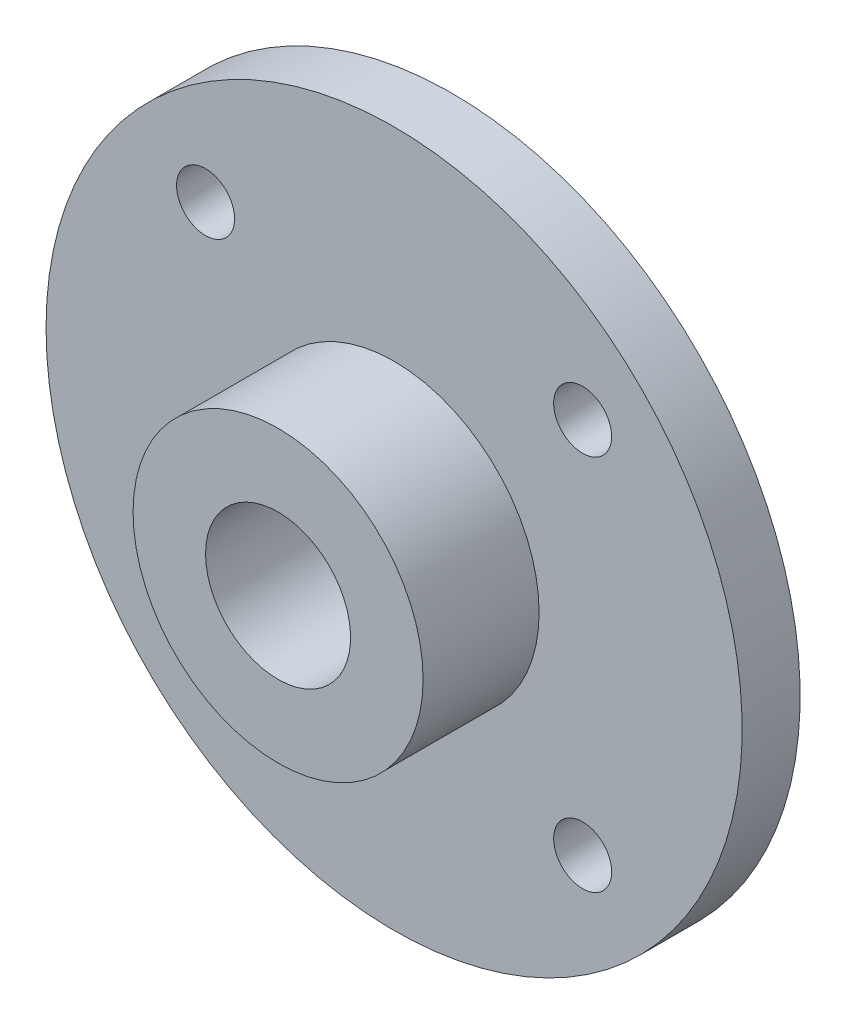
ISO-10303-21;
HEADER;
FILE_DESCRIPTION(('STEP AP214'),'2;1');
FILE_NAME('part.step','',(''),(''),'','','');
FILE_SCHEMA(('AUTOMOTIVE_DESIGN { 1 0 10303 214 1 1 1 1 }'));
ENDSEC;
DATA;
#1=APPLICATION_CONTEXT('core data for automotive mechanical design processes');
#2=APPLICATION_PROTOCOL_DEFINITION('international standard','automotive_design',2000,#1);
#3=PRODUCT_CONTEXT('',#1,'mechanical');
#4=PRODUCT('Part','Part','',(#3));
#5=PRODUCT_RELATED_PRODUCT_CATEGORY('part','',(#4));
#6=PRODUCT_DEFINITION_FORMATION('','',#4);
#7=PRODUCT_DEFINITION_CONTEXT('part definition',#1,'design');
#8=PRODUCT_DEFINITION('design','',#6,#7);
#9=PRODUCT_DEFINITION_SHAPE('','',#8);
#10=(LENGTH_UNIT() NAMED_UNIT(*) SI_UNIT(.MILLI.,.METRE.));
#11=(NAMED_UNIT(*) PLANE_ANGLE_UNIT() SI_UNIT($,.RADIAN.));
#12=(NAMED_UNIT(*) SI_UNIT($,.STERADIAN.) SOLID_ANGLE_UNIT());
#13=UNCERTAINTY_MEASURE_WITH_UNIT(LENGTH_MEASURE(1.E-05),#10,'distance_accuracy_value','');
#14=(GEOMETRIC_REPRESENTATION_CONTEXT(3) GLOBAL_UNCERTAINTY_ASSIGNED_CONTEXT((#13)) GLOBAL_UNIT_ASSIGNED_CONTEXT((#10,
#11,#12)) REPRESENTATION_CONTEXT('',''));
#15=CARTESIAN_POINT('',(0.,0.,0.));
#16=DIRECTION('',(0.,0.,1.));
#17=DIRECTION('',(1.,0.,0.));
#18=AXIS2_PLACEMENT_3D('',#15,#16,#17);
#19=CARTESIAN_POINT('',(0.,0.,6.35));
#20=DIRECTION('',(0.,0.,1.));
#21=DIRECTION('',(1.,0.,0.));
#22=AXIS2_PLACEMENT_3D('',#19,#20,#21);
#23=PLANE('',#22);
#24=CARTESIAN_POINT('',(0.,0.,6.35));
#25=DIRECTION('',(0.,0.,-1.));
#26=DIRECTION('',(-1.,0.,0.));
#27=AXIS2_PLACEMENT_3D('',#24,#25,#26);
#28=CIRCLE('',#27,7.9375);
#29=CARTESIAN_POINT('',(-7.9375,0.,6.35));
#30=VERTEX_POINT('',#29);
#31=EDGE_CURVE('E17',#30,#30,#28,.F.);
#32=ORIENTED_EDGE('',*,*,#31,.T.);
#33=EDGE_LOOP('',(#32));
#34=FACE_BOUND('',#33,.T.);
#35=ADVANCED_FACE('F14',(#34),#23,.T.);
#36=CARTESIAN_POINT('',(0.,0.,19.05));
#37=DIRECTION('',(0.,0.,-1.));
#38=DIRECTION('',(-1.,0.,0.));
#39=AXIS2_PLACEMENT_3D('',#36,#37,#38);
#40=CYLINDRICAL_SURFACE('',#39,7.9375);
#41=CARTESIAN_POINT('',(0.,0.,19.05));
#42=DIRECTION('',(0.,0.,-1.));
#43=DIRECTION('',(-1.,0.,0.));
#44=AXIS2_PLACEMENT_3D('',#41,#42,#43);
#45=CIRCLE('',#44,7.9375);
#46=CARTESIAN_POINT('',(-7.9375,0.,19.05));
#47=VERTEX_POINT('',#46);
#48=EDGE_CURVE('E57',#47,#47,#45,.T.);
#49=ORIENTED_EDGE('',*,*,#48,.F.);
#50=EDGE_LOOP('',(#49));
#51=FACE_BOUND('',#50,.T.);
#52=ORIENTED_EDGE('',*,*,#31,.F.);
#53=EDGE_LOOP('',(#52));
#54=FACE_BOUND('',#53,.T.);
#55=ADVANCED_FACE('F65',(#51,#54),#40,.F.);
#56=CARTESIAN_POINT('',(0.,0.,19.05));
#57=DIRECTION('',(0.,0.,1.));
#58=DIRECTION('',(1.,0.,0.));
#59=AXIS2_PLACEMENT_3D('',#56,#57,#58);
#60=PLANE('',#59);
#61=ORIENTED_EDGE('',*,*,#48,.T.);
#62=EDGE_LOOP('',(#61));
#63=FACE_BOUND('',#62,.T.);
#64=CARTESIAN_POINT('',(0.,0.,19.05));
#65=DIRECTION('',(0.,0.,-1.));
#66=DIRECTION('',(-1.,0.,0.));
#67=AXIS2_PLACEMENT_3D('',#64,#65,#66);
#68=CIRCLE('',#67,15.875);
#69=CARTESIAN_POINT('',(-15.875,0.,19.05));
#70=VERTEX_POINT('',#69);
#71=EDGE_CURVE('E55',#70,#70,#68,.T.);
#72=ORIENTED_EDGE('',*,*,#71,.F.);
#73=EDGE_LOOP('',(#72));
#74=FACE_BOUND('',#73,.T.);
#75=ADVANCED_FACE('F67',(#63,#74),#60,.T.);
#76=CARTESIAN_POINT('',(0.,0.,19.05));
#77=DIRECTION('',(0.,0.,-1.));
#78=DIRECTION('',(-1.,0.,0.));
#79=AXIS2_PLACEMENT_3D('',#76,#77,#78);
#80=CYLINDRICAL_SURFACE('',#79,15.875);
#81=CARTESIAN_POINT('',(0.,0.,6.35));
#82=DIRECTION('',(0.,0.,-1.));
#83=DIRECTION('',(-1.,0.,0.));
#84=AXIS2_PLACEMENT_3D('',#81,#82,#83);
#85=CIRCLE('',#84,15.875);
#86=CARTESIAN_POINT('',(-15.875,0.,6.35));
#87=VERTEX_POINT('',#86);
#88=EDGE_CURVE('E52',#87,#87,#85,.T.);
#89=ORIENTED_EDGE('',*,*,#88,.F.);
#90=EDGE_LOOP('',(#89));
#91=FACE_BOUND('',#90,.T.);
#92=ORIENTED_EDGE('',*,*,#71,.T.);
#93=EDGE_LOOP('',(#92));
#94=FACE_BOUND('',#93,.T.);
#95=ADVANCED_FACE('F74',(#91,#94),#80,.T.);
#96=CARTESIAN_POINT('',(0.,0.,6.35));
#97=DIRECTION('',(0.,0.,1.));
#98=DIRECTION('',(1.,0.,0.));
#99=AXIS2_PLACEMENT_3D('',#96,#97,#98);
#100=PLANE('',#99);
#101=CARTESIAN_POINT('',(-20.6375,-20.6375,6.35));
#102=DIRECTION('',(0.,0.,-1.));
#103=DIRECTION('',(-1.,0.,0.));
#104=AXIS2_PLACEMENT_3D('',#101,#102,#103);
#105=CIRCLE('',#104,3.175);
#106=CARTESIAN_POINT('',(-23.8125,-20.6375,6.35));
#107=VERTEX_POINT('',#106);
#108=EDGE_CURVE('E37',#107,#107,#105,.T.);
#109=ORIENTED_EDGE('',*,*,#108,.T.);
#110=EDGE_LOOP('',(#109));
#111=FACE_BOUND('',#110,.T.);
#112=CARTESIAN_POINT('',(20.6375,20.6375,6.35));
#113=DIRECTION('',(0.,0.,-1.));
#114=DIRECTION('',(-1.,0.,0.));
#115=AXIS2_PLACEMENT_3D('',#112,#113,#114);
#116=CIRCLE('',#115,3.175);
#117=CARTESIAN_POINT('',(17.4625,20.6375,6.35));
#118=VERTEX_POINT('',#117);
#119=EDGE_CURVE('E43',#118,#118,#116,.T.);
#120=ORIENTED_EDGE('',*,*,#119,.T.);
#121=EDGE_LOOP('',(#120));
#122=FACE_BOUND('',#121,.T.);
#123=CARTESIAN_POINT('',(0.,0.,6.35));
#124=DIRECTION('',(0.,0.,-1.));
#125=DIRECTION('',(-1.,0.,0.));
#126=AXIS2_PLACEMENT_3D('',#123,#124,#125);
#127=CIRCLE('',#126,38.1);
#128=CARTESIAN_POINT('',(-38.1,0.,6.35));
#129=VERTEX_POINT('',#128);
#130=EDGE_CURVE('E49',#129,#129,#127,.T.);
#131=ORIENTED_EDGE('',*,*,#130,.F.);
#132=EDGE_LOOP('',(#131));
#133=FACE_BOUND('',#132,.T.);
#134=CARTESIAN_POINT('',(-20.6375,20.6375,6.35));
#135=DIRECTION('',(0.,0.,-1.));
#136=DIRECTION('',(-1.,0.,0.));
#137=AXIS2_PLACEMENT_3D('',#134,#135,#136);
#138=CIRCLE('',#137,3.175);
#139=CARTESIAN_POINT('',(-23.8125,20.6375,6.35));
#140=VERTEX_POINT('',#139);
#141=EDGE_CURVE('E46',#140,#140,#138,.T.);
#142=ORIENTED_EDGE('',*,*,#141,.T.);
#143=EDGE_LOOP('',(#142));
#144=FACE_BOUND('',#143,.T.);
#145=CARTESIAN_POINT('',(20.6375,-20.6375,6.35));
#146=DIRECTION('',(0.,0.,-1.));
#147=DIRECTION('',(-1.,0.,0.));
#148=AXIS2_PLACEMENT_3D('',#145,#146,#147);
#149=CIRCLE('',#148,3.175);
#150=CARTESIAN_POINT('',(17.4625,-20.6375,6.35));
#151=VERTEX_POINT('',#150);
#152=EDGE_CURVE('E40',#151,#151,#149,.T.);
#153=ORIENTED_EDGE('',*,*,#152,.T.);
#154=EDGE_LOOP('',(#153));
#155=FACE_BOUND('',#154,.T.);
#156=ORIENTED_EDGE('',*,*,#88,.T.);
#157=EDGE_LOOP('',(#156));
#158=FACE_BOUND('',#157,.T.);
#159=ADVANCED_FACE('F102',(#111,#122,#133,#144,#155,#158),#100,.T.);
#160=CARTESIAN_POINT('',(0.,0.,6.35));
#161=DIRECTION('',(0.,0.,-1.));
#162=DIRECTION('',(-1.,0.,0.));
#163=AXIS2_PLACEMENT_3D('',#160,#161,#162);
#164=CYLINDRICAL_SURFACE('',#163,38.1);
#165=ORIENTED_EDGE('',*,*,#130,.T.);
#166=EDGE_LOOP('',(#165));
#167=FACE_BOUND('',#166,.T.);
#168=CARTESIAN_POINT('',(0.,0.,0.));
#169=DIRECTION('',(0.,0.,-1.));
#170=DIRECTION('',(-1.,0.,0.));
#171=AXIS2_PLACEMENT_3D('',#168,#169,#170);
#172=CIRCLE('',#171,38.1);
#173=CARTESIAN_POINT('',(-38.1,0.,0.));
#174=VERTEX_POINT('',#173);
#175=EDGE_CURVE('E34',#174,#174,#172,.F.);
#176=ORIENTED_EDGE('',*,*,#175,.T.);
#177=EDGE_LOOP('',(#176));
#178=FACE_BOUND('',#177,.T.);
#179=ADVANCED_FACE('F98',(#167,#178),#164,.T.);
#180=CARTESIAN_POINT('',(-20.6375,20.6375,6.35));
#181=DIRECTION('',(0.,0.,-1.));
#182=DIRECTION('',(-1.,0.,0.));
#183=AXIS2_PLACEMENT_3D('',#180,#181,#182);
#184=CYLINDRICAL_SURFACE('',#183,3.175);
#185=CARTESIAN_POINT('',(-20.6375,20.6375,0.));
#186=DIRECTION('',(0.,0.,-1.));
#187=DIRECTION('',(-1.,0.,0.));
#188=AXIS2_PLACEMENT_3D('',#185,#186,#187);
#189=CIRCLE('',#188,3.175);
#190=CARTESIAN_POINT('',(-23.8125,20.6375,0.));
#191=VERTEX_POINT('',#190);
#192=EDGE_CURVE('E31',#191,#191,#189,.T.);
#193=ORIENTED_EDGE('',*,*,#192,.T.);
#194=EDGE_LOOP('',(#193));
#195=FACE_BOUND('',#194,.T.);
#196=ORIENTED_EDGE('',*,*,#141,.F.);
#197=EDGE_LOOP('',(#196));
#198=FACE_BOUND('',#197,.T.);
#199=ADVANCED_FACE('F94',(#195,#198),#184,.F.);
#200=CARTESIAN_POINT('',(20.6375,20.6375,6.35));
#201=DIRECTION('',(0.,0.,-1.));
#202=DIRECTION('',(-1.,0.,0.));
#203=AXIS2_PLACEMENT_3D('',#200,#201,#202);
#204=CYLINDRICAL_SURFACE('',#203,3.175);
#205=CARTESIAN_POINT('',(20.6375,20.6375,0.));
#206=DIRECTION('',(0.,0.,-1.));
#207=DIRECTION('',(-1.,0.,0.));
#208=AXIS2_PLACEMENT_3D('',#205,#206,#207);
#209=CIRCLE('',#208,3.175);
#210=CARTESIAN_POINT('',(17.4625,20.6375,0.));
#211=VERTEX_POINT('',#210);
#212=EDGE_CURVE('E26',#211,#211,#209,.T.);
#213=ORIENTED_EDGE('',*,*,#212,.T.);
#214=EDGE_LOOP('',(#213));
#215=FACE_BOUND('',#214,.T.);
#216=ORIENTED_EDGE('',*,*,#119,.F.);
#217=EDGE_LOOP('',(#216));
#218=FACE_BOUND('',#217,.T.);
#219=ADVANCED_FACE('F90',(#215,#218),#204,.F.);
#220=CARTESIAN_POINT('',(20.6375,-20.6375,6.35));
#221=DIRECTION('',(0.,0.,-1.));
#222=DIRECTION('',(-1.,0.,0.));
#223=AXIS2_PLACEMENT_3D('',#220,#221,#222);
#224=CYLINDRICAL_SURFACE('',#223,3.175);
#225=CARTESIAN_POINT('',(20.6375,-20.6375,0.));
#226=DIRECTION('',(0.,0.,-1.));
#227=DIRECTION('',(-1.,0.,0.));
#228=AXIS2_PLACEMENT_3D('',#225,#226,#227);
#229=CIRCLE('',#228,3.175);
#230=CARTESIAN_POINT('',(17.4625,-20.6375,0.));
#231=VERTEX_POINT('',#230);
#232=EDGE_CURVE('E21',#231,#231,#229,.T.);
#233=ORIENTED_EDGE('',*,*,#232,.T.);
#234=EDGE_LOOP('',(#233));
#235=FACE_BOUND('',#234,.T.);
#236=ORIENTED_EDGE('',*,*,#152,.F.);
#237=EDGE_LOOP('',(#236));
#238=FACE_BOUND('',#237,.T.);
#239=ADVANCED_FACE('F84',(#235,#238),#224,.F.);
#240=CARTESIAN_POINT('',(-20.6375,-20.6375,6.35));
#241=DIRECTION('',(0.,0.,-1.));
#242=DIRECTION('',(-1.,0.,0.));
#243=AXIS2_PLACEMENT_3D('',#240,#241,#242);
#244=CYLINDRICAL_SURFACE('',#243,3.175);
#245=CARTESIAN_POINT('',(-20.6375,-20.6375,0.));
#246=DIRECTION('',(0.,0.,-1.));
#247=DIRECTION('',(-1.,0.,0.));
#248=AXIS2_PLACEMENT_3D('',#245,#246,#247);
#249=CIRCLE('',#248,3.175);
#250=CARTESIAN_POINT('',(-23.8125,-20.6375,0.));
#251=VERTEX_POINT('',#250);
#252=EDGE_CURVE('E10',#251,#251,#249,.T.);
#253=ORIENTED_EDGE('',*,*,#252,.T.);
#254=EDGE_LOOP('',(#253));
#255=FACE_BOUND('',#254,.T.);
#256=ORIENTED_EDGE('',*,*,#108,.F.);
#257=EDGE_LOOP('',(#256));
#258=FACE_BOUND('',#257,.T.);
#259=ADVANCED_FACE('F78',(#255,#258),#244,.F.);
#260=CARTESIAN_POINT('',(0.,0.,0.));
#261=DIRECTION('',(0.,0.,1.));
#262=DIRECTION('',(1.,0.,0.));
#263=AXIS2_PLACEMENT_3D('',#260,#261,#262);
#264=PLANE('',#263);
#265=ORIENTED_EDGE('',*,*,#252,.F.);
#266=EDGE_LOOP('',(#265));
#267=FACE_BOUND('',#266,.T.);
#268=ORIENTED_EDGE('',*,*,#232,.F.);
#269=EDGE_LOOP('',(#268));
#270=FACE_BOUND('',#269,.T.);
#271=ORIENTED_EDGE('',*,*,#212,.F.);
#272=EDGE_LOOP('',(#271));
#273=FACE_BOUND('',#272,.T.);
#274=ORIENTED_EDGE('',*,*,#192,.F.);
#275=EDGE_LOOP('',(#274));
#276=FACE_BOUND('',#275,.T.);
#277=ORIENTED_EDGE('',*,*,#175,.F.);
#278=EDGE_LOOP('',(#277));
#279=FACE_BOUND('',#278,.T.);
#280=ADVANCED_FACE('F76',(#267,#270,#273,#276,#279),#264,.F.);
#281=CLOSED_SHELL('',(#35,#55,#75,#95,#159,#179,#199,#219,#239,#259,#280));
#282=MANIFOLD_SOLID_BREP('B1',#281);
#283=ADVANCED_BREP_SHAPE_REPRESENTATION('',(#18,#282),#14);
#284=SHAPE_DEFINITION_REPRESENTATION(#9,#283);
ENDSEC;
END-ISO-10303-21;
